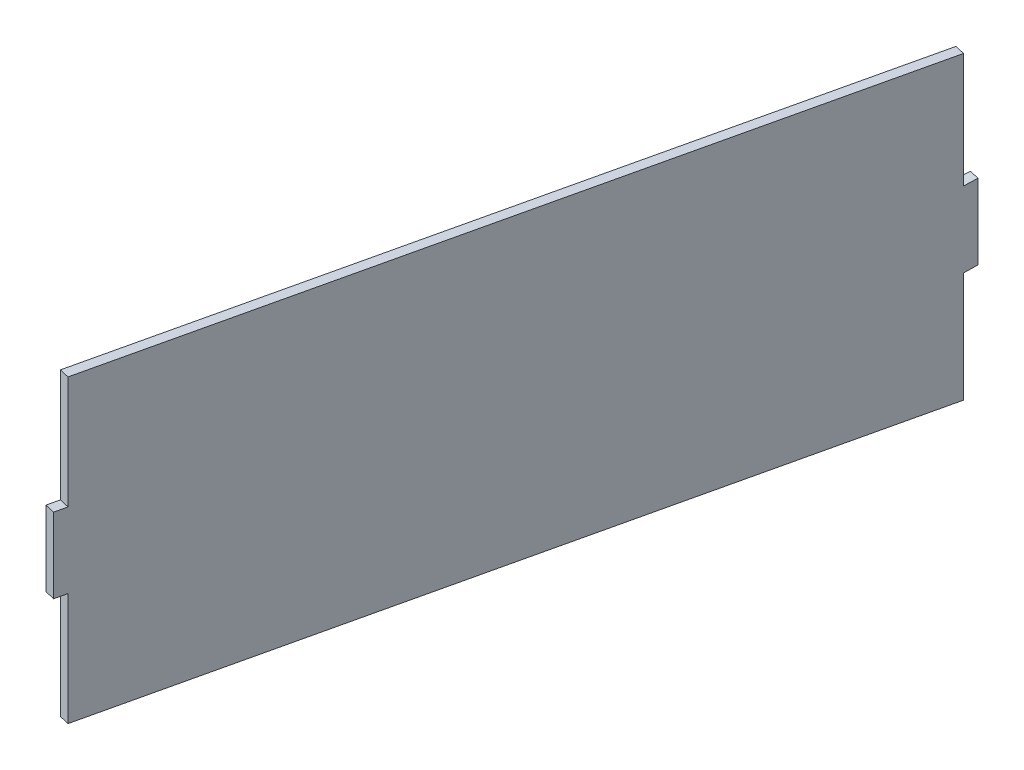
ISO-10303-21;
HEADER;
FILE_DESCRIPTION(('STEP AP214'),'2;1');
FILE_NAME('part.step','',(''),(''),'','','');
FILE_SCHEMA(('AUTOMOTIVE_DESIGN { 1 0 10303 214 1 1 1 1 }'));
ENDSEC;
DATA;
#1=APPLICATION_CONTEXT('core data for automotive mechanical design processes');
#2=APPLICATION_PROTOCOL_DEFINITION('international standard','automotive_design',2000,#1);
#3=PRODUCT_CONTEXT('',#1,'mechanical');
#4=PRODUCT('Part','Part','',(#3));
#5=PRODUCT_RELATED_PRODUCT_CATEGORY('part','',(#4));
#6=PRODUCT_DEFINITION_FORMATION('','',#4);
#7=PRODUCT_DEFINITION_CONTEXT('part definition',#1,'design');
#8=PRODUCT_DEFINITION('design','',#6,#7);
#9=PRODUCT_DEFINITION_SHAPE('','',#8);
#10=(LENGTH_UNIT() NAMED_UNIT(*) SI_UNIT(.MILLI.,.METRE.));
#11=(NAMED_UNIT(*) PLANE_ANGLE_UNIT() SI_UNIT($,.RADIAN.));
#12=(NAMED_UNIT(*) SI_UNIT($,.STERADIAN.) SOLID_ANGLE_UNIT());
#13=UNCERTAINTY_MEASURE_WITH_UNIT(LENGTH_MEASURE(1.E-05),#10,'distance_accuracy_value','');
#14=(GEOMETRIC_REPRESENTATION_CONTEXT(3) GLOBAL_UNCERTAINTY_ASSIGNED_CONTEXT((#13)) GLOBAL_UNIT_ASSIGNED_CONTEXT((#10,
#11,#12)) REPRESENTATION_CONTEXT('',''));
#15=CARTESIAN_POINT('',(0.,0.,0.));
#16=DIRECTION('',(0.,0.,1.));
#17=DIRECTION('',(1.,0.,0.));
#18=AXIS2_PLACEMENT_3D('',#15,#16,#17);
#19=CARTESIAN_POINT('',(242.32124406599,-154.081628831697,2778.07964852124));
#20=DIRECTION('',(0.,1.,0.));
#21=DIRECTION('',(-1.,0.,0.));
#22=AXIS2_PLACEMENT_3D('',#19,#20,#21);
#23=PLANE('',#22);
#24=DIRECTION('',(0.224432003343937,0.,-0.974489751549511));
#25=VECTOR('',#24,1.);
#26=CARTESIAN_POINT('',(252.222059941733,-154.081628831697,2780.35987767521));
#27=LINE('',#26,#25);
#28=CARTESIAN_POINT('',(249.528875901606,-154.081628831697,2792.05375469381));
#29=VERTEX_POINT('',#28);
#30=CARTESIAN_POINT('',(252.222059941733,-154.081628831697,2780.35987767521));
#31=VERTEX_POINT('',#30);
#32=EDGE_CURVE('E161',#29,#31,#27,.T.);
#33=ORIENTED_EDGE('',*,*,#32,.T.);
#34=DIRECTION('',(0.974489751549511,0.,0.224432003343935));
#35=VECTOR('',#34,1.);
#36=CARTESIAN_POINT('',(242.32124406599,-154.081628831697,2778.07964852124));
#37=LINE('',#36,#35);
#38=CARTESIAN_POINT('',(242.32124406599,-154.081628831697,2778.07964852124));
#39=VERTEX_POINT('',#38);
#40=EDGE_CURVE('E44',#39,#31,#37,.T.);
#41=ORIENTED_EDGE('',*,*,#40,.F.);
#42=DIRECTION('',(0.224432003343937,0.,-0.974489751549511));
#43=VECTOR('',#42,1.);
#44=CARTESIAN_POINT('',(242.32124406599,-154.081628831697,2778.07964852124));
#45=LINE('',#44,#43);
#46=CARTESIAN_POINT('',(239.628060025863,-154.081628831697,2789.77352553983));
#47=VERTEX_POINT('',#46);
#48=EDGE_CURVE('E182',#47,#39,#45,.T.);
#49=ORIENTED_EDGE('',*,*,#48,.F.);
#50=DIRECTION('',(0.974489751549511,0.,0.224432003343935));
#51=VECTOR('',#50,1.);
#52=CARTESIAN_POINT('',(239.628060025863,-154.081628831697,2789.77352553983));
#53=LINE('',#52,#51);
#54=EDGE_CURVE('E11',#47,#29,#53,.T.);
#55=ORIENTED_EDGE('',*,*,#54,.T.);
#56=EDGE_LOOP('',(#33,#41,#49,#55));
#57=FACE_BOUND('',#56,.T.);
#58=ADVANCED_FACE('F41',(#57),#23,.T.);
#59=CARTESIAN_POINT('',(239.628060025863,-154.081628831697,2789.77352553983));
#60=DIRECTION('',(-0.224432003343935,0.,0.974489751549511));
#61=DIRECTION('',(-0.974489751549511,0.,-0.224432003343935));
#62=AXIS2_PLACEMENT_3D('',#59,#60,#61);
#63=PLANE('',#62);
#64=DIRECTION('',(0.,1.,0.));
#65=VECTOR('',#64,1.);
#66=CARTESIAN_POINT('',(249.528875901606,-154.081628831697,2792.05375469381));
#67=LINE('',#66,#65);
#68=CARTESIAN_POINT('',(249.528875901606,-229.081628831698,2792.05375469381));
#69=VERTEX_POINT('',#68);
#70=EDGE_CURVE('E106',#69,#29,#67,.T.);
#71=ORIENTED_EDGE('',*,*,#70,.T.);
#72=ORIENTED_EDGE('',*,*,#54,.F.);
#73=DIRECTION('',(0.,1.,0.));
#74=VECTOR('',#73,1.);
#75=CARTESIAN_POINT('',(239.628060025863,-154.081628831697,2789.77352553983));
#76=LINE('',#75,#74);
#77=CARTESIAN_POINT('',(239.628060025863,-229.081628831698,2789.77352553983));
#78=VERTEX_POINT('',#77);
#79=EDGE_CURVE('E59',#78,#47,#76,.T.);
#80=ORIENTED_EDGE('',*,*,#79,.F.);
#81=DIRECTION('',(0.974489751549511,0.,0.224432003343935));
#82=VECTOR('',#81,1.);
#83=CARTESIAN_POINT('',(239.628060025863,-229.081628831698,2789.77352553983));
#84=LINE('',#83,#82);
#85=EDGE_CURVE('E50',#78,#69,#84,.T.);
#86=ORIENTED_EDGE('',*,*,#85,.T.);
#87=EDGE_LOOP('',(#71,#72,#80,#86));
#88=FACE_BOUND('',#87,.T.);
#89=ADVANCED_FACE('F267',(#88),#63,.T.);
#90=CARTESIAN_POINT('',(239.628060025863,-229.081628831698,2789.77352553983));
#91=DIRECTION('',(0.,-1.,0.));
#92=DIRECTION('',(1.,0.,0.));
#93=AXIS2_PLACEMENT_3D('',#90,#91,#92);
#94=PLANE('',#93);
#95=DIRECTION('',(-0.224432003343937,0.,0.974489751549511));
#96=VECTOR('',#95,1.);
#97=CARTESIAN_POINT('',(249.528875901606,-229.081628831698,2792.05375469381));
#98=LINE('',#97,#96);
#99=CARTESIAN_POINT('',(252.222059941733,-229.081628831698,2780.35987767521));
#100=VERTEX_POINT('',#99);
#101=EDGE_CURVE('E100',#100,#69,#98,.T.);
#102=ORIENTED_EDGE('',*,*,#101,.T.);
#103=ORIENTED_EDGE('',*,*,#85,.F.);
#104=DIRECTION('',(-0.224432003343937,0.,0.974489751549511));
#105=VECTOR('',#104,1.);
#106=CARTESIAN_POINT('',(239.628060025863,-229.081628831698,2789.77352553983));
#107=LINE('',#106,#105);
#108=CARTESIAN_POINT('',(242.32124406599,-229.081628831698,2778.07964852124));
#109=VERTEX_POINT('',#108);
#110=EDGE_CURVE('E143',#109,#78,#107,.T.);
#111=ORIENTED_EDGE('',*,*,#110,.F.);
#112=DIRECTION('',(0.974489751549511,0.,0.224432003343935));
#113=VECTOR('',#112,1.);
#114=CARTESIAN_POINT('',(242.32124406599,-229.081628831698,2778.07964852124));
#115=LINE('',#114,#113);
#116=EDGE_CURVE('E150',#109,#100,#115,.T.);
#117=ORIENTED_EDGE('',*,*,#116,.T.);
#118=EDGE_LOOP('',(#102,#103,#111,#117));
#119=FACE_BOUND('',#118,.T.);
#120=ADVANCED_FACE('F156',(#119),#94,.T.);
#121=CARTESIAN_POINT('',(242.32124406599,-229.081628831698,2778.07964852124));
#122=DIRECTION('',(-0.224432003343935,0.,0.974489751549511));
#123=DIRECTION('',(-0.974489751549511,0.,-0.224432003343935));
#124=AXIS2_PLACEMENT_3D('',#121,#122,#123);
#125=PLANE('',#124);
#126=DIRECTION('',(0.,1.,0.));
#127=VECTOR('',#126,1.);
#128=CARTESIAN_POINT('',(252.222059941733,-229.081628831698,2780.35987767521));
#129=LINE('',#128,#127);
#130=CARTESIAN_POINT('',(252.222059941733,-341.581628831697,2780.35987767521));
#131=VERTEX_POINT('',#130);
#132=EDGE_CURVE('E153',#131,#100,#129,.T.);
#133=ORIENTED_EDGE('',*,*,#132,.T.);
#134=ORIENTED_EDGE('',*,*,#116,.F.);
#135=DIRECTION('',(0.,1.,0.));
#136=VECTOR('',#135,1.);
#137=CARTESIAN_POINT('',(242.32124406599,-229.081628831698,2778.07964852124));
#138=LINE('',#137,#136);
#139=CARTESIAN_POINT('',(242.32124406599,-341.581628831697,2778.07964852124));
#140=VERTEX_POINT('',#139);
#141=EDGE_CURVE('E139',#140,#109,#138,.T.);
#142=ORIENTED_EDGE('',*,*,#141,.F.);
#143=DIRECTION('',(0.974489751549511,0.,0.224432003343935));
#144=VECTOR('',#143,1.);
#145=CARTESIAN_POINT('',(242.32124406599,-341.581628831697,2778.07964852124));
#146=LINE('',#145,#144);
#147=EDGE_CURVE('E154',#140,#131,#146,.T.);
#148=ORIENTED_EDGE('',*,*,#147,.T.);
#149=EDGE_LOOP('',(#133,#134,#142,#148));
#150=FACE_BOUND('',#149,.T.);
#151=ADVANCED_FACE('F151',(#150),#125,.T.);
#152=CARTESIAN_POINT('',(242.32124406599,-341.581628831697,2778.07964852124));
#153=DIRECTION('',(0.,-1.,0.));
#154=DIRECTION('',(1.,0.,0.));
#155=AXIS2_PLACEMENT_3D('',#152,#153,#154);
#156=PLANE('',#155);
#157=DIRECTION('',(-0.224432003343935,0.,0.974489751549511));
#158=VECTOR('',#157,1.);
#159=CARTESIAN_POINT('',(252.222059941733,-341.581628831697,2780.35987767521));
#160=LINE('',#159,#158);
#161=CARTESIAN_POINT('',(419.721789204409,-341.581628831697,2053.07158045472));
#162=VERTEX_POINT('',#161);
#163=EDGE_CURVE('E178',#162,#131,#160,.T.);
#164=ORIENTED_EDGE('',*,*,#163,.T.);
#165=ORIENTED_EDGE('',*,*,#147,.F.);
#166=DIRECTION('',(-0.224432003343935,0.,0.974489751549511));
#167=VECTOR('',#166,1.);
#168=CARTESIAN_POINT('',(242.32124406599,-341.581628831697,2778.07964852124));
#169=LINE('',#168,#167);
#170=CARTESIAN_POINT('',(409.820973328666,-341.581628831697,2050.79135130074));
#171=VERTEX_POINT('',#170);
#172=EDGE_CURVE('E145',#171,#140,#169,.T.);
#173=ORIENTED_EDGE('',*,*,#172,.F.);
#174=DIRECTION('',(0.974489751549511,0.,0.224432003343935));
#175=VECTOR('',#174,1.);
#176=CARTESIAN_POINT('',(409.820973328666,-341.581628831697,2050.79135130074));
#177=LINE('',#176,#175);
#178=EDGE_CURVE('E186',#171,#162,#177,.T.);
#179=ORIENTED_EDGE('',*,*,#178,.T.);
#180=EDGE_LOOP('',(#164,#165,#173,#179));
#181=FACE_BOUND('',#180,.T.);
#182=ADVANCED_FACE('F246',(#181),#156,.T.);
#183=CARTESIAN_POINT('',(409.820973328666,-231.512401326091,2050.79135130074));
#184=DIRECTION('',(0.224432003343935,0.,-0.974489751549511));
#185=DIRECTION('',(0.974489751549511,0.,0.224432003343935));
#186=AXIS2_PLACEMENT_3D('',#183,#184,#185);
#187=PLANE('',#186);
#188=DIRECTION('',(0.,-1.,0.));
#189=VECTOR('',#188,1.);
#190=CARTESIAN_POINT('',(419.721789204409,-231.512401326091,2053.07158045472));
#191=LINE('',#190,#189);
#192=CARTESIAN_POINT('',(419.721789204409,-231.512401326091,2053.07158045472));
#193=VERTEX_POINT('',#192);
#194=EDGE_CURVE('E176',#193,#162,#191,.T.);
#195=ORIENTED_EDGE('',*,*,#194,.T.);
#196=ORIENTED_EDGE('',*,*,#178,.F.);
#197=DIRECTION('',(0.,-1.,0.));
#198=VECTOR('',#197,1.);
#199=CARTESIAN_POINT('',(409.820973328666,-231.512401326091,2050.79135130074));
#200=LINE('',#199,#198);
#201=CARTESIAN_POINT('',(409.820973328666,-231.512401326091,2050.79135130074));
#202=VERTEX_POINT('',#201);
#203=EDGE_CURVE('E236',#202,#171,#200,.T.);
#204=ORIENTED_EDGE('',*,*,#203,.F.);
#205=DIRECTION('',(0.974489751549511,0.,0.224432003343935));
#206=VECTOR('',#205,1.);
#207=CARTESIAN_POINT('',(409.820973328666,-231.512401326091,2050.79135130074));
#208=LINE('',#207,#206);
#209=EDGE_CURVE('E189',#202,#193,#208,.T.);
#210=ORIENTED_EDGE('',*,*,#209,.T.);
#211=EDGE_LOOP('',(#195,#196,#204,#210));
#212=FACE_BOUND('',#211,.T.);
#213=ADVANCED_FACE('F242',(#212),#187,.T.);
#214=CARTESIAN_POINT('',(412.514157368793,-229.081628831698,2039.09747428215));
#215=DIRECTION('',(0.0445569798398018,-0.980094365221818,-0.19346759627389));
#216=DIRECTION('',(0.,-0.193659930680787,0.981068718922743));
#217=AXIS2_PLACEMENT_3D('',#214,#215,#216);
#218=PLANE('',#217);
#219=DIRECTION('',(-0.219964541852833,-0.198532202074226,0.955091914460086));
#220=VECTOR('',#219,1.);
#221=CARTESIAN_POINT('',(422.414973244536,-229.081628831698,2041.37770343612));
#222=LINE('',#221,#220);
#223=CARTESIAN_POINT('',(422.414973244536,-229.081628831698,2041.37770343612));
#224=VERTEX_POINT('',#223);
#225=EDGE_CURVE('E174',#224,#193,#222,.T.);
#226=ORIENTED_EDGE('',*,*,#225,.T.);
#227=ORIENTED_EDGE('',*,*,#209,.F.);
#228=DIRECTION('',(-0.219964541852833,-0.198532202074226,0.955091914460086));
#229=VECTOR('',#228,1.);
#230=CARTESIAN_POINT('',(412.514157368793,-229.081628831698,2039.09747428215));
#231=LINE('',#230,#229);
#232=CARTESIAN_POINT('',(412.514157368793,-229.081628831698,2039.09747428215));
#233=VERTEX_POINT('',#232);
#234=EDGE_CURVE('E234',#233,#202,#231,.T.);
#235=ORIENTED_EDGE('',*,*,#234,.F.);
#236=DIRECTION('',(0.974489751549511,0.,0.224432003343935));
#237=VECTOR('',#236,1.);
#238=CARTESIAN_POINT('',(412.514157368793,-229.081628831698,2039.09747428215));
#239=LINE('',#238,#237);
#240=EDGE_CURVE('E192',#233,#224,#239,.T.);
#241=ORIENTED_EDGE('',*,*,#240,.T.);
#242=EDGE_LOOP('',(#226,#227,#235,#241));
#243=FACE_BOUND('',#242,.T.);
#244=ADVANCED_FACE('F250',(#243),#218,.T.);
#245=CARTESIAN_POINT('',(412.514157368793,-154.081628831698,2039.09747428215));
#246=DIRECTION('',(0.224432003343935,0.,-0.974489751549511));
#247=DIRECTION('',(0.974489751549511,0.,0.224432003343935));
#248=AXIS2_PLACEMENT_3D('',#245,#246,#247);
#249=PLANE('',#248);
#250=DIRECTION('',(0.,-1.,0.));
#251=VECTOR('',#250,1.);
#252=CARTESIAN_POINT('',(422.414973244536,-154.081628831698,2041.37770343612));
#253=LINE('',#252,#251);
#254=CARTESIAN_POINT('',(422.414973244536,-154.081628831698,2041.37770343612));
#255=VERTEX_POINT('',#254);
#256=EDGE_CURVE('E172',#255,#224,#253,.T.);
#257=ORIENTED_EDGE('',*,*,#256,.T.);
#258=ORIENTED_EDGE('',*,*,#240,.F.);
#259=DIRECTION('',(0.,-1.,0.));
#260=VECTOR('',#259,1.);
#261=CARTESIAN_POINT('',(412.514157368793,-154.081628831698,2039.09747428215));
#262=LINE('',#261,#260);
#263=CARTESIAN_POINT('',(412.514157368793,-154.081628831698,2039.09747428215));
#264=VERTEX_POINT('',#263);
#265=EDGE_CURVE('E228',#264,#233,#262,.T.);
#266=ORIENTED_EDGE('',*,*,#265,.F.);
#267=DIRECTION('',(0.974489751549511,0.,0.224432003343935));
#268=VECTOR('',#267,1.);
#269=CARTESIAN_POINT('',(412.514157368793,-154.081628831698,2039.09747428215));
#270=LINE('',#269,#268);
#271=EDGE_CURVE('E195',#264,#255,#270,.T.);
#272=ORIENTED_EDGE('',*,*,#271,.T.);
#273=EDGE_LOOP('',(#257,#258,#266,#272));
#274=FACE_BOUND('',#273,.T.);
#275=ADVANCED_FACE('F254',(#274),#249,.T.);
#276=CARTESIAN_POINT('',(412.514157368793,-154.081628831698,2039.09747428215));
#277=DIRECTION('',(-0.0399824688444815,0.984003416879626,0.173604947378586));
#278=DIRECTION('',(0.,0.173743876214061,-0.98479087398194));
#279=AXIS2_PLACEMENT_3D('',#276,#277,#278);
#280=PLANE('',#279);
#281=DIRECTION('',(0.22084185814757,0.178149587620128,-0.958901245238897));
#282=VECTOR('',#281,1.);
#283=CARTESIAN_POINT('',(422.414973244536,-154.081628831698,2041.37770343612));
#284=LINE('',#283,#282);
#285=CARTESIAN_POINT('',(419.721789204408,-156.254177234243,2053.07158045472));
#286=VERTEX_POINT('',#285);
#287=EDGE_CURVE('E170',#286,#255,#284,.T.);
#288=ORIENTED_EDGE('',*,*,#287,.T.);
#289=ORIENTED_EDGE('',*,*,#271,.F.);
#290=DIRECTION('',(0.22084185814757,0.178149587620128,-0.958901245238897));
#291=VECTOR('',#290,1.);
#292=CARTESIAN_POINT('',(412.514157368793,-154.081628831698,2039.09747428215));
#293=LINE('',#292,#291);
#294=CARTESIAN_POINT('',(409.820973328665,-156.254177234243,2050.79135130074));
#295=VERTEX_POINT('',#294);
#296=EDGE_CURVE('E225',#295,#264,#293,.T.);
#297=ORIENTED_EDGE('',*,*,#296,.F.);
#298=DIRECTION('',(0.974489751549511,0.,0.224432003343935));
#299=VECTOR('',#298,1.);
#300=CARTESIAN_POINT('',(409.820973328665,-156.254177234243,2050.79135130074));
#301=LINE('',#300,#299);
#302=EDGE_CURVE('E198',#295,#286,#301,.T.);
#303=ORIENTED_EDGE('',*,*,#302,.T.);
#304=EDGE_LOOP('',(#288,#289,#297,#303));
#305=FACE_BOUND('',#304,.T.);
#306=ADVANCED_FACE('F257',(#305),#280,.T.);
#307=CARTESIAN_POINT('',(409.820973328665,-41.5816288316976,2050.79135130074));
#308=DIRECTION('',(0.224432003343935,0.,-0.974489751549511));
#309=DIRECTION('',(0.974489751549511,0.,0.224432003343935));
#310=AXIS2_PLACEMENT_3D('',#307,#308,#309);
#311=PLANE('',#310);
#312=DIRECTION('',(0.,-1.,0.));
#313=VECTOR('',#312,1.);
#314=CARTESIAN_POINT('',(419.721789204408,-41.5816288316975,2053.07158045472));
#315=LINE('',#314,#313);
#316=CARTESIAN_POINT('',(419.721789204408,-41.5816288316975,2053.07158045472));
#317=VERTEX_POINT('',#316);
#318=EDGE_CURVE('E168',#317,#286,#315,.T.);
#319=ORIENTED_EDGE('',*,*,#318,.T.);
#320=ORIENTED_EDGE('',*,*,#302,.F.);
#321=DIRECTION('',(0.,-1.,0.));
#322=VECTOR('',#321,1.);
#323=CARTESIAN_POINT('',(409.820973328665,-41.5816288316976,2050.79135130074));
#324=LINE('',#323,#322);
#325=CARTESIAN_POINT('',(409.820973328665,-41.5816288316976,2050.79135130074));
#326=VERTEX_POINT('',#325);
#327=EDGE_CURVE('E223',#326,#295,#324,.T.);
#328=ORIENTED_EDGE('',*,*,#327,.F.);
#329=DIRECTION('',(0.974489751549511,0.,0.224432003343935));
#330=VECTOR('',#329,1.);
#331=CARTESIAN_POINT('',(409.820973328665,-41.5816288316976,2050.79135130074));
#332=LINE('',#331,#330);
#333=EDGE_CURVE('E201',#326,#317,#332,.T.);
#334=ORIENTED_EDGE('',*,*,#333,.T.);
#335=EDGE_LOOP('',(#319,#320,#328,#334));
#336=FACE_BOUND('',#335,.T.);
#337=ADVANCED_FACE('F221',(#336),#311,.T.);
#338=CARTESIAN_POINT('',(242.32124406599,-41.5816288316974,2778.07964852124));
#339=DIRECTION('',(0.,1.,0.));
#340=DIRECTION('',(-1.,0.,0.));
#341=AXIS2_PLACEMENT_3D('',#338,#339,#340);
#342=PLANE('',#341);
#343=DIRECTION('',(0.224432003343935,0.,-0.974489751549511));
#344=VECTOR('',#343,1.);
#345=CARTESIAN_POINT('',(252.222059941733,-41.5816288316974,2780.35987767521));
#346=LINE('',#345,#344);
#347=CARTESIAN_POINT('',(252.222059941733,-41.5816288316974,2780.35987767521));
#348=VERTEX_POINT('',#347);
#349=EDGE_CURVE('E166',#348,#317,#346,.T.);
#350=ORIENTED_EDGE('',*,*,#349,.T.);
#351=ORIENTED_EDGE('',*,*,#333,.F.);
#352=DIRECTION('',(0.224432003343935,0.,-0.974489751549511));
#353=VECTOR('',#352,1.);
#354=CARTESIAN_POINT('',(242.32124406599,-41.5816288316974,2778.07964852124));
#355=LINE('',#354,#353);
#356=CARTESIAN_POINT('',(242.32124406599,-41.5816288316974,2778.07964852124));
#357=VERTEX_POINT('',#356);
#358=EDGE_CURVE('E226',#357,#326,#355,.T.);
#359=ORIENTED_EDGE('',*,*,#358,.F.);
#360=DIRECTION('',(0.974489751549511,0.,0.224432003343935));
#361=VECTOR('',#360,1.);
#362=CARTESIAN_POINT('',(242.32124406599,-41.5816288316974,2778.07964852124));
#363=LINE('',#362,#361);
#364=EDGE_CURVE('E203',#357,#348,#363,.T.);
#365=ORIENTED_EDGE('',*,*,#364,.T.);
#366=EDGE_LOOP('',(#350,#351,#359,#365));
#367=FACE_BOUND('',#366,.T.);
#368=ADVANCED_FACE('F218',(#367),#342,.T.);
#369=CARTESIAN_POINT('',(242.32124406599,-41.5816288316974,2778.07964852124));
#370=DIRECTION('',(-0.224432003343935,0.,0.974489751549511));
#371=DIRECTION('',(-0.974489751549511,0.,-0.224432003343935));
#372=AXIS2_PLACEMENT_3D('',#369,#370,#371);
#373=PLANE('',#372);
#374=DIRECTION('',(0.,1.,0.));
#375=VECTOR('',#374,1.);
#376=CARTESIAN_POINT('',(252.222059941733,-41.5816288316974,2780.35987767521));
#377=LINE('',#376,#375);
#378=EDGE_CURVE('E164',#31,#348,#377,.T.);
#379=ORIENTED_EDGE('',*,*,#378,.T.);
#380=ORIENTED_EDGE('',*,*,#364,.F.);
#381=DIRECTION('',(0.,1.,0.));
#382=VECTOR('',#381,1.);
#383=CARTESIAN_POINT('',(242.32124406599,-41.5816288316974,2778.07964852124));
#384=LINE('',#383,#382);
#385=EDGE_CURVE('E114',#39,#357,#384,.T.);
#386=ORIENTED_EDGE('',*,*,#385,.F.);
#387=ORIENTED_EDGE('',*,*,#40,.T.);
#388=EDGE_LOOP('',(#379,#380,#386,#387));
#389=FACE_BOUND('',#388,.T.);
#390=ADVANCED_FACE('F209',(#389),#373,.T.);
#391=CARTESIAN_POINT('',(837.700186498557,0.,192.928382015836));
#392=DIRECTION('',(-0.974489751549511,0.,-0.224432003343937));
#393=DIRECTION('',(0.224432003343937,0.,-0.974489751549511));
#394=AXIS2_PLACEMENT_3D('',#391,#392,#393);
#395=PLANE('',#394);
#396=ORIENTED_EDGE('',*,*,#48,.T.);
#397=ORIENTED_EDGE('',*,*,#385,.T.);
#398=ORIENTED_EDGE('',*,*,#358,.T.);
#399=ORIENTED_EDGE('',*,*,#327,.T.);
#400=ORIENTED_EDGE('',*,*,#296,.T.);
#401=ORIENTED_EDGE('',*,*,#265,.T.);
#402=ORIENTED_EDGE('',*,*,#234,.T.);
#403=ORIENTED_EDGE('',*,*,#203,.T.);
#404=ORIENTED_EDGE('',*,*,#172,.T.);
#405=ORIENTED_EDGE('',*,*,#141,.T.);
#406=ORIENTED_EDGE('',*,*,#110,.T.);
#407=ORIENTED_EDGE('',*,*,#79,.T.);
#408=EDGE_LOOP('',(#396,#397,#398,#399,#400,#401,#402,#403,#404,#405,#406,#407));
#409=FACE_BOUND('',#408,.T.);
#410=ADVANCED_FACE('F141',(#409),#395,.T.);
#411=CARTESIAN_POINT('',(847.6010023743,0.,195.20861116981));
#412=DIRECTION('',(-0.974489751549511,0.,-0.224432003343937));
#413=DIRECTION('',(0.224432003343937,0.,-0.974489751549511));
#414=AXIS2_PLACEMENT_3D('',#411,#412,#413);
#415=PLANE('',#414);
#416=ORIENTED_EDGE('',*,*,#32,.F.);
#417=ORIENTED_EDGE('',*,*,#70,.F.);
#418=ORIENTED_EDGE('',*,*,#101,.F.);
#419=ORIENTED_EDGE('',*,*,#132,.F.);
#420=ORIENTED_EDGE('',*,*,#163,.F.);
#421=ORIENTED_EDGE('',*,*,#194,.F.);
#422=ORIENTED_EDGE('',*,*,#225,.F.);
#423=ORIENTED_EDGE('',*,*,#256,.F.);
#424=ORIENTED_EDGE('',*,*,#287,.F.);
#425=ORIENTED_EDGE('',*,*,#318,.F.);
#426=ORIENTED_EDGE('',*,*,#349,.F.);
#427=ORIENTED_EDGE('',*,*,#378,.F.);
#428=EDGE_LOOP('',(#416,#417,#418,#419,#420,#421,#422,#423,#424,#425,#426,#427));
#429=FACE_BOUND('',#428,.T.);
#430=ADVANCED_FACE('F214',(#429),#415,.F.);
#431=CLOSED_SHELL('',(#58,#89,#120,#151,#182,#213,#244,#275,#306,#337,#368,#390,#410,#430));
#432=MANIFOLD_SOLID_BREP('B2',#431);
#433=ADVANCED_BREP_SHAPE_REPRESENTATION('',(#18,#432),#14);
#434=SHAPE_DEFINITION_REPRESENTATION(#9,#433);
ENDSEC;
END-ISO-10303-21;
